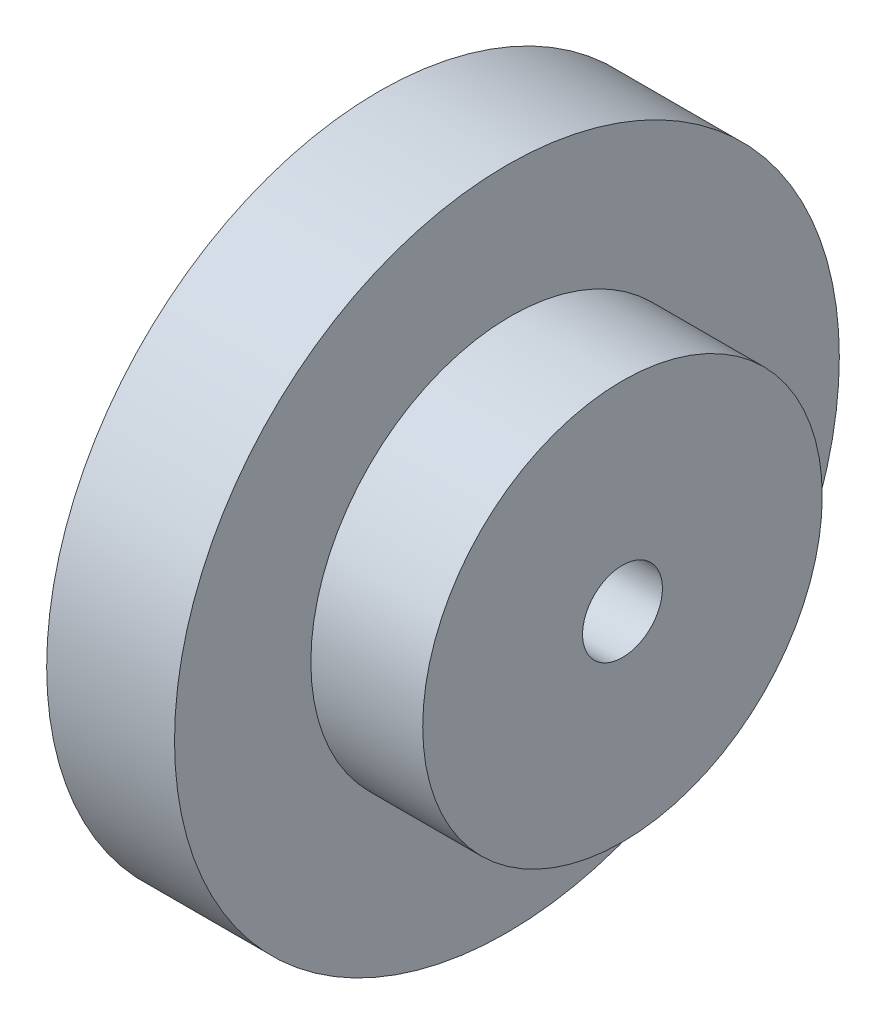
ISO-10303-21;
HEADER;
FILE_DESCRIPTION(('STEP AP214'),'2;1');
FILE_NAME('part.step','',(''),(''),'','','');
FILE_SCHEMA(('AUTOMOTIVE_DESIGN { 1 0 10303 214 1 1 1 1 }'));
ENDSEC;
DATA;
#1=APPLICATION_CONTEXT('core data for automotive mechanical design processes');
#2=APPLICATION_PROTOCOL_DEFINITION('international standard','automotive_design',2000,#1);
#3=PRODUCT_CONTEXT('',#1,'mechanical');
#4=PRODUCT('Part','Part','',(#3));
#5=PRODUCT_RELATED_PRODUCT_CATEGORY('part','',(#4));
#6=PRODUCT_DEFINITION_FORMATION('','',#4);
#7=PRODUCT_DEFINITION_CONTEXT('part definition',#1,'design');
#8=PRODUCT_DEFINITION('design','',#6,#7);
#9=PRODUCT_DEFINITION_SHAPE('','',#8);
#10=(LENGTH_UNIT() NAMED_UNIT(*) SI_UNIT(.MILLI.,.METRE.));
#11=(NAMED_UNIT(*) PLANE_ANGLE_UNIT() SI_UNIT($,.RADIAN.));
#12=(NAMED_UNIT(*) SI_UNIT($,.STERADIAN.) SOLID_ANGLE_UNIT());
#13=UNCERTAINTY_MEASURE_WITH_UNIT(LENGTH_MEASURE(1.E-05),#10,'distance_accuracy_value','');
#14=(GEOMETRIC_REPRESENTATION_CONTEXT(3) GLOBAL_UNCERTAINTY_ASSIGNED_CONTEXT((#13)) GLOBAL_UNIT_ASSIGNED_CONTEXT((#10,
#11,#12)) REPRESENTATION_CONTEXT('',''));
#15=CARTESIAN_POINT('',(0.,0.,0.));
#16=DIRECTION('',(0.,0.,1.));
#17=DIRECTION('',(1.,0.,0.));
#18=AXIS2_PLACEMENT_3D('',#15,#16,#17);
#19=CARTESIAN_POINT('',(8.,-0.19719948959146,0.));
#20=DIRECTION('',(1.,0.,0.));
#21=DIRECTION('',(0.,0.,-1.));
#22=AXIS2_PLACEMENT_3D('',#19,#20,#21);
#23=PLANE('',#22);
#24=CARTESIAN_POINT('',(8.,-0.19719948959146,0.));
#25=DIRECTION('',(1.,0.,0.));
#26=DIRECTION('',(0.,0.,-1.));
#27=AXIS2_PLACEMENT_3D('',#24,#25,#26);
#28=CIRCLE('',#27,20.8);
#29=CARTESIAN_POINT('',(8.,-0.19719948959146,-20.8));
#30=VERTEX_POINT('',#29);
#31=EDGE_CURVE('E12',#30,#30,#28,.T.);
#32=ORIENTED_EDGE('',*,*,#31,.T.);
#33=EDGE_LOOP('',(#32));
#34=FACE_BOUND('',#33,.T.);
#35=CARTESIAN_POINT('',(8.,-0.19719948959146,-0.230786773613545));
#36=DIRECTION('',(1.,0.,0.));
#37=DIRECTION('',(0.,0.,-1.));
#38=AXIS2_PLACEMENT_3D('',#35,#36,#37);
#39=CIRCLE('',#38,12.5);
#40=CARTESIAN_POINT('',(8.,-0.19719948959146,-12.7307867736135));
#41=VERTEX_POINT('',#40);
#42=EDGE_CURVE('E58',#41,#41,#39,.T.);
#43=ORIENTED_EDGE('',*,*,#42,.F.);
#44=EDGE_LOOP('',(#43));
#45=FACE_BOUND('',#44,.T.);
#46=ADVANCED_FACE('F42',(#34,#45),#23,.T.);
#47=CARTESIAN_POINT('',(0.,-0.19719948959146,0.));
#48=DIRECTION('',(1.,0.,0.));
#49=DIRECTION('',(0.,0.,-1.));
#50=AXIS2_PLACEMENT_3D('',#47,#48,#49);
#51=PLANE('',#50);
#52=CARTESIAN_POINT('',(0.,-0.19719948959146,0.));
#53=DIRECTION('',(1.,0.,0.));
#54=DIRECTION('',(0.,0.,-1.));
#55=AXIS2_PLACEMENT_3D('',#52,#53,#54);
#56=CIRCLE('',#55,20.8);
#57=CARTESIAN_POINT('',(0.,-0.19719948959146,-20.8));
#58=VERTEX_POINT('',#57);
#59=EDGE_CURVE('E46',#58,#58,#56,.T.);
#60=ORIENTED_EDGE('',*,*,#59,.F.);
#61=EDGE_LOOP('',(#60));
#62=FACE_BOUND('',#61,.T.);
#63=CARTESIAN_POINT('',(0.,-0.19719948959146,-0.230786773613545));
#64=DIRECTION('',(1.,0.,0.));
#65=DIRECTION('',(0.,0.,-1.));
#66=AXIS2_PLACEMENT_3D('',#63,#64,#65);
#67=CIRCLE('',#66,2.5);
#68=CARTESIAN_POINT('',(0.,-0.19719948959146,-2.73078677361354));
#69=VERTEX_POINT('',#68);
#70=EDGE_CURVE('E53',#69,#69,#67,.T.);
#71=ORIENTED_EDGE('',*,*,#70,.T.);
#72=EDGE_LOOP('',(#71));
#73=FACE_BOUND('',#72,.T.);
#74=ADVANCED_FACE('F83',(#62,#73),#51,.F.);
#75=CARTESIAN_POINT('',(8.,-0.19719948959146,0.));
#76=DIRECTION('',(-1.,0.,0.));
#77=DIRECTION('',(0.,0.,1.));
#78=AXIS2_PLACEMENT_3D('',#75,#76,#77);
#79=CYLINDRICAL_SURFACE('',#78,20.8);
#80=ORIENTED_EDGE('',*,*,#31,.F.);
#81=EDGE_LOOP('',(#80));
#82=FACE_BOUND('',#81,.T.);
#83=ORIENTED_EDGE('',*,*,#59,.T.);
#84=EDGE_LOOP('',(#83));
#85=FACE_BOUND('',#84,.T.);
#86=ADVANCED_FACE('F44',(#82,#85),#79,.T.);
#87=CARTESIAN_POINT('',(8.,-0.19719948959146,-0.230786773613545));
#88=DIRECTION('',(-1.,0.,0.));
#89=DIRECTION('',(0.,0.,1.));
#90=AXIS2_PLACEMENT_3D('',#87,#88,#89);
#91=CYLINDRICAL_SURFACE('',#90,2.5);
#92=ORIENTED_EDGE('',*,*,#70,.F.);
#93=EDGE_LOOP('',(#92));
#94=FACE_BOUND('',#93,.T.);
#95=CARTESIAN_POINT('',(15.,-0.19719948959146,-0.230786773613545));
#96=DIRECTION('',(1.,0.,0.));
#97=DIRECTION('',(0.,0.,-1.));
#98=AXIS2_PLACEMENT_3D('',#95,#96,#97);
#99=CIRCLE('',#98,2.5);
#100=CARTESIAN_POINT('',(15.,-0.19719948959146,-2.73078677361354));
#101=VERTEX_POINT('',#100);
#102=EDGE_CURVE('E61',#101,#101,#99,.T.);
#103=ORIENTED_EDGE('',*,*,#102,.T.);
#104=EDGE_LOOP('',(#103));
#105=FACE_BOUND('',#104,.T.);
#106=ADVANCED_FACE('F67',(#94,#105),#91,.F.);
#107=CARTESIAN_POINT('',(15.,-0.19719948959146,-0.230786773613545));
#108=DIRECTION('',(1.,0.,0.));
#109=DIRECTION('',(0.,0.,-1.));
#110=AXIS2_PLACEMENT_3D('',#107,#108,#109);
#111=PLANE('',#110);
#112=CARTESIAN_POINT('',(15.,-0.19719948959146,-0.230786773613545));
#113=DIRECTION('',(1.,0.,0.));
#114=DIRECTION('',(0.,0.,-1.));
#115=AXIS2_PLACEMENT_3D('',#112,#113,#114);
#116=CIRCLE('',#115,12.5);
#117=CARTESIAN_POINT('',(15.,-0.19719948959146,-12.7307867736135));
#118=VERTEX_POINT('',#117);
#119=EDGE_CURVE('E57',#118,#118,#116,.T.);
#120=ORIENTED_EDGE('',*,*,#119,.T.);
#121=EDGE_LOOP('',(#120));
#122=FACE_BOUND('',#121,.T.);
#123=ORIENTED_EDGE('',*,*,#102,.F.);
#124=EDGE_LOOP('',(#123));
#125=FACE_BOUND('',#124,.T.);
#126=ADVANCED_FACE('F69',(#122,#125),#111,.T.);
#127=CARTESIAN_POINT('',(15.,-0.19719948959146,-0.230786773613545));
#128=DIRECTION('',(-1.,0.,0.));
#129=DIRECTION('',(0.,0.,1.));
#130=AXIS2_PLACEMENT_3D('',#127,#128,#129);
#131=CYLINDRICAL_SURFACE('',#130,12.5);
#132=ORIENTED_EDGE('',*,*,#119,.F.);
#133=EDGE_LOOP('',(#132));
#134=FACE_BOUND('',#133,.T.);
#135=ORIENTED_EDGE('',*,*,#42,.T.);
#136=EDGE_LOOP('',(#135));
#137=FACE_BOUND('',#136,.T.);
#138=ADVANCED_FACE('F71',(#134,#137),#131,.T.);
#139=CLOSED_SHELL('',(#46,#74,#86,#106,#126,#138));
#140=MANIFOLD_SOLID_BREP('B2',#139);
#141=ADVANCED_BREP_SHAPE_REPRESENTATION('',(#18,#140),#14);
#142=SHAPE_DEFINITION_REPRESENTATION(#9,#141);
ENDSEC;
END-ISO-10303-21;
